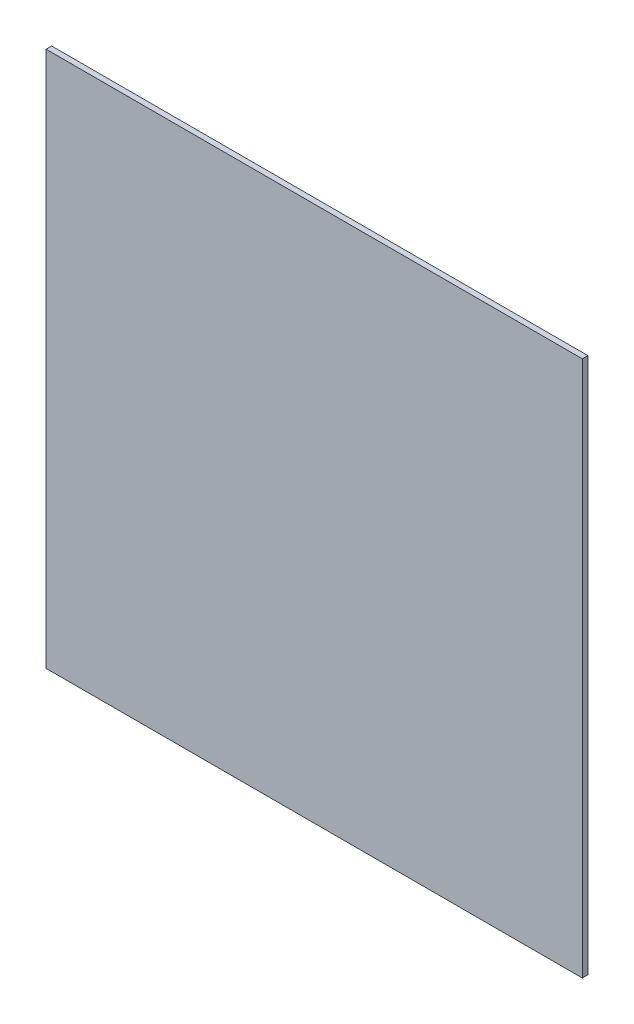
ISO-10303-21;
HEADER;
FILE_DESCRIPTION(('STEP AP214'),'2;1');
FILE_NAME('part.step','',(''),(''),'','','');
FILE_SCHEMA(('AUTOMOTIVE_DESIGN { 1 0 10303 214 1 1 1 1 }'));
ENDSEC;
DATA;
#1=APPLICATION_CONTEXT('core data for automotive mechanical design processes');
#2=APPLICATION_PROTOCOL_DEFINITION('international standard','automotive_design',2000,#1);
#3=PRODUCT_CONTEXT('',#1,'mechanical');
#4=PRODUCT('Part','Part','',(#3));
#5=PRODUCT_RELATED_PRODUCT_CATEGORY('part','',(#4));
#6=PRODUCT_DEFINITION_FORMATION('','',#4);
#7=PRODUCT_DEFINITION_CONTEXT('part definition',#1,'design');
#8=PRODUCT_DEFINITION('design','',#6,#7);
#9=PRODUCT_DEFINITION_SHAPE('','',#8);
#10=(LENGTH_UNIT() NAMED_UNIT(*) SI_UNIT(.MILLI.,.METRE.));
#11=(NAMED_UNIT(*) PLANE_ANGLE_UNIT() SI_UNIT($,.RADIAN.));
#12=(NAMED_UNIT(*) SI_UNIT($,.STERADIAN.) SOLID_ANGLE_UNIT());
#13=UNCERTAINTY_MEASURE_WITH_UNIT(LENGTH_MEASURE(1.E-05),#10,'distance_accuracy_value','');
#14=(GEOMETRIC_REPRESENTATION_CONTEXT(3) GLOBAL_UNCERTAINTY_ASSIGNED_CONTEXT((#13)) GLOBAL_UNIT_ASSIGNED_CONTEXT((#10,
#11,#12)) REPRESENTATION_CONTEXT('',''));
#15=CARTESIAN_POINT('',(0.,0.,0.));
#16=DIRECTION('',(0.,0.,1.));
#17=DIRECTION('',(1.,0.,0.));
#18=AXIS2_PLACEMENT_3D('',#15,#16,#17);
#19=CARTESIAN_POINT('',(-66.1459495060431,47.3733934432523,1.5875));
#20=DIRECTION('',(1.,0.,0.));
#21=DIRECTION('',(0.,1.,0.));
#22=AXIS2_PLACEMENT_3D('',#19,#20,#21);
#23=PLANE('',#22);
#24=DIRECTION('',(0.,-1.,0.));
#25=VECTOR('',#24,1.);
#26=CARTESIAN_POINT('',(-66.1459495060431,47.3733934432523,0.));
#27=LINE('',#26,#25);
#28=CARTESIAN_POINT('',(-66.1459495060431,47.3733934432523,0.));
#29=VERTEX_POINT('',#28);
#30=CARTESIAN_POINT('',(-66.1459495060431,-105.026606556748,0.));
#31=VERTEX_POINT('',#30);
#32=EDGE_CURVE('E97',#29,#31,#27,.T.);
#33=ORIENTED_EDGE('',*,*,#32,.T.);
#34=DIRECTION('',(0.,0.,-1.));
#35=VECTOR('',#34,1.);
#36=CARTESIAN_POINT('',(-66.1459495060431,-105.026606556748,1.5875));
#37=LINE('',#36,#35);
#38=CARTESIAN_POINT('',(-66.1459495060431,-105.026606556748,1.5875));
#39=VERTEX_POINT('',#38);
#40=EDGE_CURVE('E11',#39,#31,#37,.T.);
#41=ORIENTED_EDGE('',*,*,#40,.F.);
#42=DIRECTION('',(0.,-1.,0.));
#43=VECTOR('',#42,1.);
#44=CARTESIAN_POINT('',(-66.1459495060431,47.3733934432523,1.5875));
#45=LINE('',#44,#43);
#46=CARTESIAN_POINT('',(-66.1459495060431,47.3733934432523,1.5875));
#47=VERTEX_POINT('',#46);
#48=EDGE_CURVE('E85',#47,#39,#45,.T.);
#49=ORIENTED_EDGE('',*,*,#48,.F.);
#50=DIRECTION('',(0.,0.,-1.));
#51=VECTOR('',#50,1.);
#52=CARTESIAN_POINT('',(-66.1459495060431,47.3733934432523,1.5875));
#53=LINE('',#52,#51);
#54=EDGE_CURVE('E93',#47,#29,#53,.T.);
#55=ORIENTED_EDGE('',*,*,#54,.T.);
#56=EDGE_LOOP('',(#33,#41,#49,#55));
#57=FACE_BOUND('',#56,.T.);
#58=ADVANCED_FACE('F34',(#57),#23,.F.);
#59=CARTESIAN_POINT('',(-66.1459495060431,-105.026606556748,1.5875));
#60=DIRECTION('',(0.,1.,0.));
#61=DIRECTION('',(0.,0.,1.));
#62=AXIS2_PLACEMENT_3D('',#59,#60,#61);
#63=PLANE('',#62);
#64=DIRECTION('',(1.,0.,0.));
#65=VECTOR('',#64,1.);
#66=CARTESIAN_POINT('',(-66.1459495060431,-105.026606556748,0.));
#67=LINE('',#66,#65);
#68=CARTESIAN_POINT('',(86.254050493957,-105.026606556748,0.));
#69=VERTEX_POINT('',#68);
#70=EDGE_CURVE('E89',#31,#69,#67,.T.);
#71=ORIENTED_EDGE('',*,*,#70,.T.);
#72=DIRECTION('',(0.,0.,-1.));
#73=VECTOR('',#72,1.);
#74=CARTESIAN_POINT('',(86.254050493957,-105.026606556748,1.5875));
#75=LINE('',#74,#73);
#76=CARTESIAN_POINT('',(86.254050493957,-105.026606556748,1.5875));
#77=VERTEX_POINT('',#76);
#78=EDGE_CURVE('E42',#77,#69,#75,.T.);
#79=ORIENTED_EDGE('',*,*,#78,.F.);
#80=DIRECTION('',(1.,0.,0.));
#81=VECTOR('',#80,1.);
#82=CARTESIAN_POINT('',(-66.1459495060431,-105.026606556748,1.5875));
#83=LINE('',#82,#81);
#84=EDGE_CURVE('E80',#39,#77,#83,.T.);
#85=ORIENTED_EDGE('',*,*,#84,.F.);
#86=ORIENTED_EDGE('',*,*,#40,.T.);
#87=EDGE_LOOP('',(#71,#79,#85,#86));
#88=FACE_BOUND('',#87,.T.);
#89=ADVANCED_FACE('F88',(#88),#63,.F.);
#90=CARTESIAN_POINT('',(86.2540504939569,47.3733934432523,1.5875));
#91=DIRECTION('',(-1.,0.,0.));
#92=DIRECTION('',(0.,-1.,0.));
#93=AXIS2_PLACEMENT_3D('',#90,#91,#92);
#94=PLANE('',#93);
#95=DIRECTION('',(0.,1.,0.));
#96=VECTOR('',#95,1.);
#97=CARTESIAN_POINT('',(86.2540504939569,47.3733934432523,0.));
#98=LINE('',#97,#96);
#99=CARTESIAN_POINT('',(86.2540504939569,47.3733934432523,0.));
#100=VERTEX_POINT('',#99);
#101=EDGE_CURVE('E67',#69,#100,#98,.T.);
#102=ORIENTED_EDGE('',*,*,#101,.T.);
#103=DIRECTION('',(0.,0.,-1.));
#104=VECTOR('',#103,1.);
#105=CARTESIAN_POINT('',(86.2540504939569,47.3733934432523,1.5875));
#106=LINE('',#105,#104);
#107=CARTESIAN_POINT('',(86.2540504939569,47.3733934432523,1.5875));
#108=VERTEX_POINT('',#107);
#109=EDGE_CURVE('E90',#108,#100,#106,.T.);
#110=ORIENTED_EDGE('',*,*,#109,.F.);
#111=DIRECTION('',(0.,1.,0.));
#112=VECTOR('',#111,1.);
#113=CARTESIAN_POINT('',(86.2540504939569,47.3733934432523,1.5875));
#114=LINE('',#113,#112);
#115=EDGE_CURVE('E83',#77,#108,#114,.T.);
#116=ORIENTED_EDGE('',*,*,#115,.F.);
#117=ORIENTED_EDGE('',*,*,#78,.T.);
#118=EDGE_LOOP('',(#102,#110,#116,#117));
#119=FACE_BOUND('',#118,.T.);
#120=ADVANCED_FACE('F91',(#119),#94,.F.);
#121=CARTESIAN_POINT('',(-66.1459495060431,47.3733934432523,1.5875));
#122=DIRECTION('',(0.,-1.,0.));
#123=DIRECTION('',(0.,0.,-1.));
#124=AXIS2_PLACEMENT_3D('',#121,#122,#123);
#125=PLANE('',#124);
#126=DIRECTION('',(-1.,0.,0.));
#127=VECTOR('',#126,1.);
#128=CARTESIAN_POINT('',(-66.1459495060431,47.3733934432523,0.));
#129=LINE('',#128,#127);
#130=EDGE_CURVE('E73',#100,#29,#129,.T.);
#131=ORIENTED_EDGE('',*,*,#130,.T.);
#132=ORIENTED_EDGE('',*,*,#54,.F.);
#133=DIRECTION('',(-1.,0.,0.));
#134=VECTOR('',#133,1.);
#135=CARTESIAN_POINT('',(-66.1459495060431,47.3733934432523,1.5875));
#136=LINE('',#135,#134);
#137=EDGE_CURVE('E50',#108,#47,#136,.T.);
#138=ORIENTED_EDGE('',*,*,#137,.F.);
#139=ORIENTED_EDGE('',*,*,#109,.T.);
#140=EDGE_LOOP('',(#131,#132,#138,#139));
#141=FACE_BOUND('',#140,.T.);
#142=ADVANCED_FACE('F104',(#141),#125,.F.);
#143=CARTESIAN_POINT('',(0.,0.,1.5875));
#144=DIRECTION('',(0.,0.,1.));
#145=DIRECTION('',(1.,0.,0.));
#146=AXIS2_PLACEMENT_3D('',#143,#144,#145);
#147=PLANE('',#146);
#148=ORIENTED_EDGE('',*,*,#48,.T.);
#149=ORIENTED_EDGE('',*,*,#84,.T.);
#150=ORIENTED_EDGE('',*,*,#115,.T.);
#151=ORIENTED_EDGE('',*,*,#137,.T.);
#152=EDGE_LOOP('',(#148,#149,#150,#151));
#153=FACE_BOUND('',#152,.T.);
#154=ADVANCED_FACE('F81',(#153),#147,.T.);
#155=CARTESIAN_POINT('',(0.,0.,0.));
#156=DIRECTION('',(0.,0.,1.));
#157=DIRECTION('',(1.,0.,0.));
#158=AXIS2_PLACEMENT_3D('',#155,#156,#157);
#159=PLANE('',#158);
#160=ORIENTED_EDGE('',*,*,#32,.F.);
#161=ORIENTED_EDGE('',*,*,#130,.F.);
#162=ORIENTED_EDGE('',*,*,#101,.F.);
#163=ORIENTED_EDGE('',*,*,#70,.F.);
#164=EDGE_LOOP('',(#160,#161,#162,#163));
#165=FACE_BOUND('',#164,.T.);
#166=ADVANCED_FACE('F107',(#165),#159,.F.);
#167=CLOSED_SHELL('',(#58,#89,#120,#142,#154,#166));
#168=MANIFOLD_SOLID_BREP('B2',#167);
#169=ADVANCED_BREP_SHAPE_REPRESENTATION('',(#18,#168),#14);
#170=SHAPE_DEFINITION_REPRESENTATION(#9,#169);
ENDSEC;
END-ISO-10303-21;
